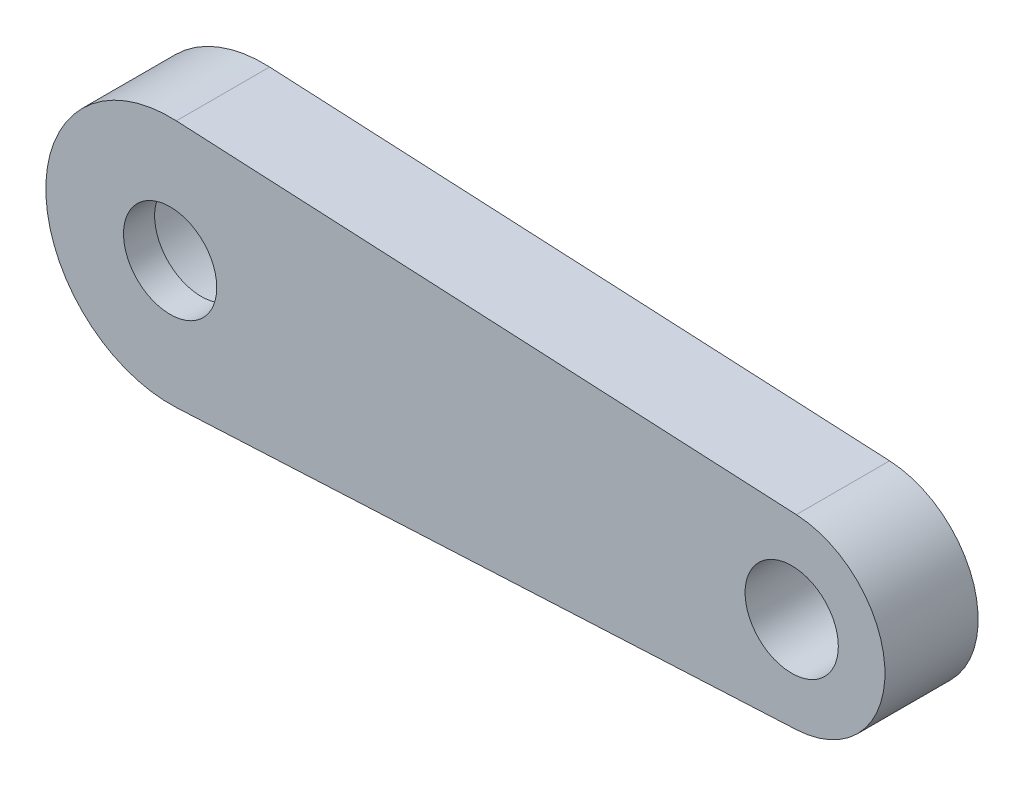
ISO-10303-21;
HEADER;
FILE_DESCRIPTION(('STEP AP214'),'2;1');
FILE_NAME('part.step','',(''),(''),'','','');
FILE_SCHEMA(('AUTOMOTIVE_DESIGN { 1 0 10303 214 1 1 1 1 }'));
ENDSEC;
DATA;
#1=APPLICATION_CONTEXT('core data for automotive mechanical design processes');
#2=APPLICATION_PROTOCOL_DEFINITION('international standard','automotive_design',2000,#1);
#3=PRODUCT_CONTEXT('',#1,'mechanical');
#4=PRODUCT('Part','Part','',(#3));
#5=PRODUCT_RELATED_PRODUCT_CATEGORY('part','',(#4));
#6=PRODUCT_DEFINITION_FORMATION('','',#4);
#7=PRODUCT_DEFINITION_CONTEXT('part definition',#1,'design');
#8=PRODUCT_DEFINITION('design','',#6,#7);
#9=PRODUCT_DEFINITION_SHAPE('','',#8);
#10=(LENGTH_UNIT() NAMED_UNIT(*) SI_UNIT(.MILLI.,.METRE.));
#11=(NAMED_UNIT(*) PLANE_ANGLE_UNIT() SI_UNIT($,.RADIAN.));
#12=(NAMED_UNIT(*) SI_UNIT($,.STERADIAN.) SOLID_ANGLE_UNIT());
#13=UNCERTAINTY_MEASURE_WITH_UNIT(LENGTH_MEASURE(1.E-05),#10,'distance_accuracy_value','');
#14=(GEOMETRIC_REPRESENTATION_CONTEXT(3) GLOBAL_UNCERTAINTY_ASSIGNED_CONTEXT((#13)) GLOBAL_UNIT_ASSIGNED_CONTEXT((#10,
#11,#12)) REPRESENTATION_CONTEXT('',''));
#15=CARTESIAN_POINT('',(0.,0.,0.));
#16=DIRECTION('',(0.,0.,1.));
#17=DIRECTION('',(1.,0.,0.));
#18=AXIS2_PLACEMENT_3D('',#15,#16,#17);
#19=CARTESIAN_POINT('',(20.,0.,3.));
#20=DIRECTION('',(0.,0.,-1.));
#21=DIRECTION('',(-1.,0.,0.));
#22=AXIS2_PLACEMENT_3D('',#19,#20,#21);
#23=CYLINDRICAL_SURFACE('',#22,3.);
#24=CARTESIAN_POINT('',(20.,0.,0.));
#25=DIRECTION('',(0.,0.,1.));
#26=DIRECTION('',(1.,0.,0.));
#27=AXIS2_PLACEMENT_3D('',#24,#25,#26);
#28=CIRCLE('',#27,3.);
#29=CARTESIAN_POINT('',(20.15,2.99624765331573,0.));
#30=VERTEX_POINT('',#29);
#31=CARTESIAN_POINT('',(20.15,-2.99624765331573,0.));
#32=VERTEX_POINT('',#31);
#33=EDGE_CURVE('E108',#30,#32,#28,.F.);
#34=ORIENTED_EDGE('',*,*,#33,.F.);
#35=DIRECTION('',(0.,0.,-1.));
#36=VECTOR('',#35,1.);
#37=CARTESIAN_POINT('',(20.15,2.99624765331573,3.));
#38=LINE('',#37,#36);
#39=CARTESIAN_POINT('',(20.15,2.99624765331573,3.));
#40=VERTEX_POINT('',#39);
#41=EDGE_CURVE('E11',#40,#30,#38,.T.);
#42=ORIENTED_EDGE('',*,*,#41,.F.);
#43=CARTESIAN_POINT('',(20.,0.,3.));
#44=DIRECTION('',(0.,0.,1.));
#45=DIRECTION('',(1.,0.,0.));
#46=AXIS2_PLACEMENT_3D('',#43,#44,#45);
#47=CIRCLE('',#46,3.);
#48=CARTESIAN_POINT('',(20.15,-2.99624765331573,3.));
#49=VERTEX_POINT('',#48);
#50=EDGE_CURVE('E95',#40,#49,#47,.F.);
#51=ORIENTED_EDGE('',*,*,#50,.T.);
#52=DIRECTION('',(0.,0.,-1.));
#53=VECTOR('',#52,1.);
#54=CARTESIAN_POINT('',(20.15,-2.99624765331573,3.));
#55=LINE('',#54,#53);
#56=EDGE_CURVE('E52',#49,#32,#55,.T.);
#57=ORIENTED_EDGE('',*,*,#56,.T.);
#58=EDGE_LOOP('',(#34,#42,#51,#57));
#59=FACE_BOUND('',#58,.T.);
#60=ADVANCED_FACE('F35',(#59),#23,.T.);
#61=CARTESIAN_POINT('',(0.2,3.99499687108763,3.));
#62=DIRECTION('',(0.05,0.998749217771909,0.));
#63=DIRECTION('',(-0.998749217771909,0.05,0.));
#64=AXIS2_PLACEMENT_3D('',#61,#62,#63);
#65=PLANE('',#64);
#66=DIRECTION('',(0.998749217771909,-0.05,0.));
#67=VECTOR('',#66,1.);
#68=CARTESIAN_POINT('',(0.2,3.99499687108763,0.));
#69=LINE('',#68,#67);
#70=CARTESIAN_POINT('',(0.2,3.99499687108763,0.));
#71=VERTEX_POINT('',#70);
#72=EDGE_CURVE('E84',#71,#30,#69,.T.);
#73=ORIENTED_EDGE('',*,*,#72,.F.);
#74=DIRECTION('',(0.,0.,-1.));
#75=VECTOR('',#74,1.);
#76=CARTESIAN_POINT('',(0.2,3.99499687108763,3.));
#77=LINE('',#76,#75);
#78=CARTESIAN_POINT('',(0.2,3.99499687108763,3.));
#79=VERTEX_POINT('',#78);
#80=EDGE_CURVE('E44',#79,#71,#77,.T.);
#81=ORIENTED_EDGE('',*,*,#80,.F.);
#82=DIRECTION('',(0.998749217771909,-0.05,0.));
#83=VECTOR('',#82,1.);
#84=CARTESIAN_POINT('',(0.2,3.99499687108763,3.));
#85=LINE('',#84,#83);
#86=EDGE_CURVE('E82',#79,#40,#85,.T.);
#87=ORIENTED_EDGE('',*,*,#86,.T.);
#88=ORIENTED_EDGE('',*,*,#41,.T.);
#89=EDGE_LOOP('',(#73,#81,#87,#88));
#90=FACE_BOUND('',#89,.T.);
#91=ADVANCED_FACE('F80',(#90),#65,.T.);
#92=CARTESIAN_POINT('',(0.,0.,3.));
#93=DIRECTION('',(0.,0.,-1.));
#94=DIRECTION('',(-1.,0.,0.));
#95=AXIS2_PLACEMENT_3D('',#92,#93,#94);
#96=CYLINDRICAL_SURFACE('',#95,4.);
#97=CARTESIAN_POINT('',(0.,0.,0.));
#98=DIRECTION('',(0.,0.,1.));
#99=DIRECTION('',(1.,0.,0.));
#100=AXIS2_PLACEMENT_3D('',#97,#98,#99);
#101=CIRCLE('',#100,4.);
#102=CARTESIAN_POINT('',(0.2,-3.99499687108764,0.));
#103=VERTEX_POINT('',#102);
#104=EDGE_CURVE('E112',#71,#103,#101,.T.);
#105=ORIENTED_EDGE('',*,*,#104,.T.);
#106=DIRECTION('',(0.,0.,-1.));
#107=VECTOR('',#106,1.);
#108=CARTESIAN_POINT('',(0.2,-3.99499687108764,3.));
#109=LINE('',#108,#107);
#110=CARTESIAN_POINT('',(0.2,-3.99499687108764,3.));
#111=VERTEX_POINT('',#110);
#112=EDGE_CURVE('E66',#111,#103,#109,.T.);
#113=ORIENTED_EDGE('',*,*,#112,.F.);
#114=CARTESIAN_POINT('',(0.,0.,3.));
#115=DIRECTION('',(0.,0.,1.));
#116=DIRECTION('',(1.,0.,0.));
#117=AXIS2_PLACEMENT_3D('',#114,#115,#116);
#118=CIRCLE('',#117,4.);
#119=EDGE_CURVE('E87',#79,#111,#118,.T.);
#120=ORIENTED_EDGE('',*,*,#119,.F.);
#121=ORIENTED_EDGE('',*,*,#80,.T.);
#122=EDGE_LOOP('',(#105,#113,#120,#121));
#123=FACE_BOUND('',#122,.T.);
#124=ADVANCED_FACE('F88',(#123),#96,.T.);
#125=CARTESIAN_POINT('',(0.2,-3.99499687108764,3.));
#126=DIRECTION('',(0.05,-0.998749217771909,0.));
#127=DIRECTION('',(0.998749217771909,0.05,0.));
#128=AXIS2_PLACEMENT_3D('',#125,#126,#127);
#129=PLANE('',#128);
#130=DIRECTION('',(-0.998749217771909,-0.05,0.));
#131=VECTOR('',#130,1.);
#132=CARTESIAN_POINT('',(0.2,-3.99499687108764,0.));
#133=LINE('',#132,#131);
#134=EDGE_CURVE('E114',#32,#103,#133,.T.);
#135=ORIENTED_EDGE('',*,*,#134,.F.);
#136=ORIENTED_EDGE('',*,*,#56,.F.);
#137=DIRECTION('',(-0.998749217771909,-0.05,0.));
#138=VECTOR('',#137,1.);
#139=CARTESIAN_POINT('',(0.2,-3.99499687108764,3.));
#140=LINE('',#139,#138);
#141=EDGE_CURVE('E91',#49,#111,#140,.T.);
#142=ORIENTED_EDGE('',*,*,#141,.T.);
#143=ORIENTED_EDGE('',*,*,#112,.T.);
#144=EDGE_LOOP('',(#135,#136,#142,#143));
#145=FACE_BOUND('',#144,.T.);
#146=ADVANCED_FACE('F159',(#145),#129,.T.);
#147=CARTESIAN_POINT('',(20.,0.,3.));
#148=DIRECTION('',(0.,0.,-1.));
#149=DIRECTION('',(-1.,0.,0.));
#150=AXIS2_PLACEMENT_3D('',#147,#148,#149);
#151=CYLINDRICAL_SURFACE('',#150,1.5);
#152=CARTESIAN_POINT('',(20.,0.,3.));
#153=DIRECTION('',(0.,0.,1.));
#154=DIRECTION('',(1.,0.,0.));
#155=AXIS2_PLACEMENT_3D('',#152,#153,#154);
#156=CIRCLE('',#155,1.5);
#157=CARTESIAN_POINT('',(21.5,0.,3.));
#158=VERTEX_POINT('',#157);
#159=EDGE_CURVE('E97',#158,#158,#156,.T.);
#160=ORIENTED_EDGE('',*,*,#159,.T.);
#161=EDGE_LOOP('',(#160));
#162=FACE_BOUND('',#161,.T.);
#163=CARTESIAN_POINT('',(20.,0.,0.));
#164=DIRECTION('',(0.,0.,1.));
#165=DIRECTION('',(1.,0.,0.));
#166=AXIS2_PLACEMENT_3D('',#163,#164,#165);
#167=CIRCLE('',#166,1.5);
#168=CARTESIAN_POINT('',(21.5,0.,0.));
#169=VERTEX_POINT('',#168);
#170=EDGE_CURVE('E105',#169,#169,#167,.T.);
#171=ORIENTED_EDGE('',*,*,#170,.F.);
#172=EDGE_LOOP('',(#171));
#173=FACE_BOUND('',#172,.T.);
#174=ADVANCED_FACE('F37',(#162,#173),#151,.F.);
#175=CARTESIAN_POINT('',(0.,0.,3.));
#176=DIRECTION('',(0.,0.,-1.));
#177=DIRECTION('',(-1.,0.,0.));
#178=AXIS2_PLACEMENT_3D('',#175,#176,#177);
#179=CYLINDRICAL_SURFACE('',#178,1.5);
#180=CARTESIAN_POINT('',(0.,0.,2.));
#181=DIRECTION('',(0.,0.,1.));
#182=DIRECTION('',(1.,0.,0.));
#183=AXIS2_PLACEMENT_3D('',#180,#181,#182);
#184=CIRCLE('',#183,1.5);
#185=CARTESIAN_POINT('',(1.5,0.,2.));
#186=VERTEX_POINT('',#185);
#187=EDGE_CURVE('E126',#186,#186,#184,.T.);
#188=ORIENTED_EDGE('',*,*,#187,.F.);
#189=EDGE_LOOP('',(#188));
#190=FACE_BOUND('',#189,.T.);
#191=CARTESIAN_POINT('',(0.,0.,3.));
#192=DIRECTION('',(0.,0.,1.));
#193=DIRECTION('',(1.,0.,0.));
#194=AXIS2_PLACEMENT_3D('',#191,#192,#193);
#195=CIRCLE('',#194,1.5);
#196=CARTESIAN_POINT('',(1.5,0.,3.));
#197=VERTEX_POINT('',#196);
#198=EDGE_CURVE('E102',#197,#197,#195,.T.);
#199=ORIENTED_EDGE('',*,*,#198,.T.);
#200=EDGE_LOOP('',(#199));
#201=FACE_BOUND('',#200,.T.);
#202=ADVANCED_FACE('F135',(#190,#201),#179,.F.);
#203=CARTESIAN_POINT('',(0.,0.,3.));
#204=DIRECTION('',(0.,0.,1.));
#205=DIRECTION('',(1.,0.,0.));
#206=AXIS2_PLACEMENT_3D('',#203,#204,#205);
#207=PLANE('',#206);
#208=ORIENTED_EDGE('',*,*,#159,.F.);
#209=EDGE_LOOP('',(#208));
#210=FACE_BOUND('',#209,.T.);
#211=ORIENTED_EDGE('',*,*,#50,.F.);
#212=ORIENTED_EDGE('',*,*,#86,.F.);
#213=ORIENTED_EDGE('',*,*,#119,.T.);
#214=ORIENTED_EDGE('',*,*,#141,.F.);
#215=EDGE_LOOP('',(#211,#212,#213,#214));
#216=FACE_BOUND('',#215,.T.);
#217=ORIENTED_EDGE('',*,*,#198,.F.);
#218=EDGE_LOOP('',(#217));
#219=FACE_BOUND('',#218,.T.);
#220=ADVANCED_FACE('F93',(#210,#216,#219),#207,.T.);
#221=CARTESIAN_POINT('',(0.,0.,0.));
#222=DIRECTION('',(0.,0.,1.));
#223=DIRECTION('',(1.,0.,0.));
#224=AXIS2_PLACEMENT_3D('',#221,#222,#223);
#225=PLANE('',#224);
#226=CARTESIAN_POINT('',(0.,0.,0.));
#227=DIRECTION('',(0.,0.,1.));
#228=DIRECTION('',(1.,0.,0.));
#229=AXIS2_PLACEMENT_3D('',#226,#227,#228);
#230=CIRCLE('',#229,2.5);
#231=CARTESIAN_POINT('',(2.5,0.,0.));
#232=VERTEX_POINT('',#231);
#233=EDGE_CURVE('E123',#232,#232,#230,.T.);
#234=ORIENTED_EDGE('',*,*,#233,.T.);
#235=EDGE_LOOP('',(#234));
#236=FACE_BOUND('',#235,.T.);
#237=ORIENTED_EDGE('',*,*,#170,.T.);
#238=EDGE_LOOP('',(#237));
#239=FACE_BOUND('',#238,.T.);
#240=ORIENTED_EDGE('',*,*,#33,.T.);
#241=ORIENTED_EDGE('',*,*,#134,.T.);
#242=ORIENTED_EDGE('',*,*,#104,.F.);
#243=ORIENTED_EDGE('',*,*,#72,.T.);
#244=EDGE_LOOP('',(#240,#241,#242,#243));
#245=FACE_BOUND('',#244,.T.);
#246=ADVANCED_FACE('F141',(#236,#239,#245),#225,.F.);
#247=CARTESIAN_POINT('',(0.,0.,2.));
#248=DIRECTION('',(0.,0.,-1.));
#249=DIRECTION('',(-1.,0.,0.));
#250=AXIS2_PLACEMENT_3D('',#247,#248,#249);
#251=CYLINDRICAL_SURFACE('',#250,2.5);
#252=CARTESIAN_POINT('',(0.,0.,2.));
#253=DIRECTION('',(0.,0.,1.));
#254=DIRECTION('',(1.,0.,0.));
#255=AXIS2_PLACEMENT_3D('',#252,#253,#254);
#256=CIRCLE('',#255,2.5);
#257=CARTESIAN_POINT('',(2.5,0.,2.));
#258=VERTEX_POINT('',#257);
#259=EDGE_CURVE('E109',#258,#258,#256,.T.);
#260=ORIENTED_EDGE('',*,*,#259,.T.);
#261=EDGE_LOOP('',(#260));
#262=FACE_BOUND('',#261,.T.);
#263=ORIENTED_EDGE('',*,*,#233,.F.);
#264=EDGE_LOOP('',(#263));
#265=FACE_BOUND('',#264,.T.);
#266=ADVANCED_FACE('F147',(#262,#265),#251,.F.);
#267=CARTESIAN_POINT('',(0.,0.,2.));
#268=DIRECTION('',(0.,0.,1.));
#269=DIRECTION('',(1.,0.,0.));
#270=AXIS2_PLACEMENT_3D('',#267,#268,#269);
#271=PLANE('',#270);
#272=ORIENTED_EDGE('',*,*,#187,.T.);
#273=EDGE_LOOP('',(#272));
#274=FACE_BOUND('',#273,.T.);
#275=ORIENTED_EDGE('',*,*,#259,.F.);
#276=EDGE_LOOP('',(#275));
#277=FACE_BOUND('',#276,.T.);
#278=ADVANCED_FACE('F132',(#274,#277),#271,.F.);
#279=CLOSED_SHELL('',(#60,#91,#124,#146,#174,#202,#220,#246,#266,#278));
#280=MANIFOLD_SOLID_BREP('B2',#279);
#281=ADVANCED_BREP_SHAPE_REPRESENTATION('',(#18,#280),#14);
#282=SHAPE_DEFINITION_REPRESENTATION(#9,#281);
ENDSEC;
END-ISO-10303-21;
